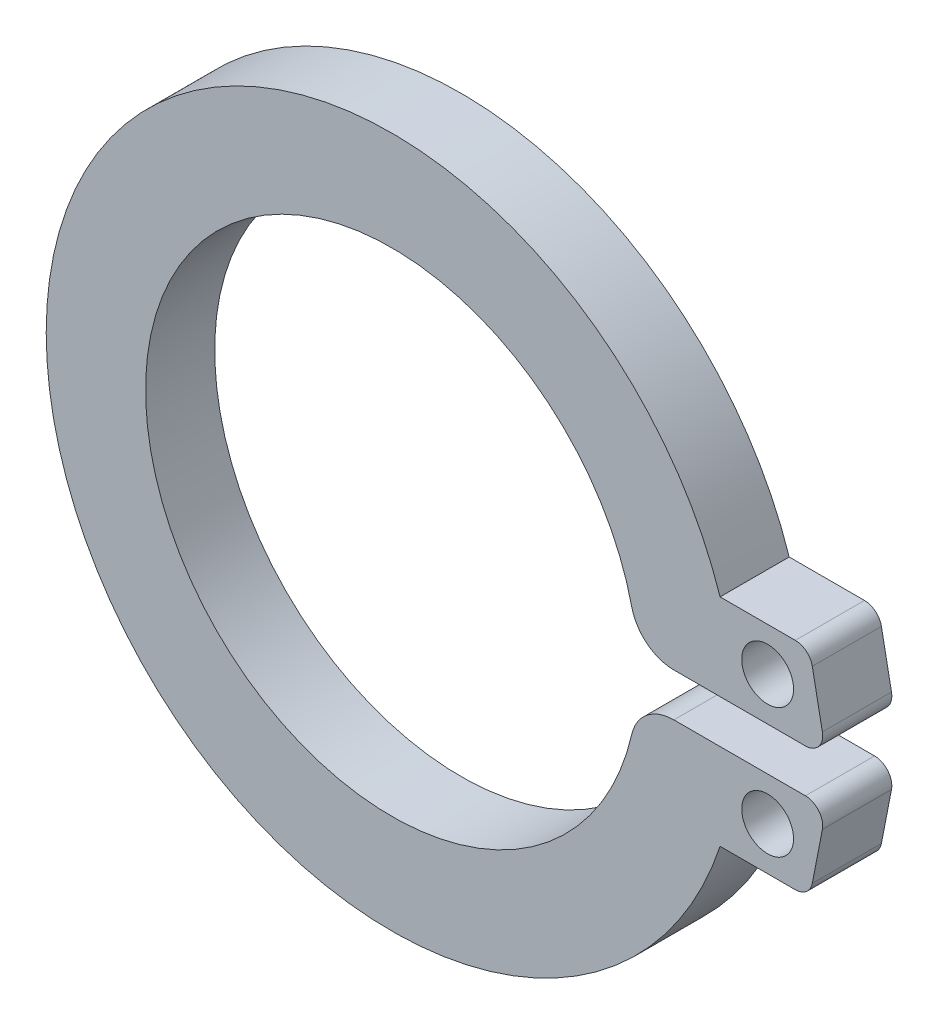
ISO-10303-21;
HEADER;
FILE_DESCRIPTION(('STEP AP214'),'2;1');
FILE_NAME('part.step','',(''),(''),'','','');
FILE_SCHEMA(('AUTOMOTIVE_DESIGN { 1 0 10303 214 1 1 1 1 }'));
ENDSEC;
DATA;
#1=APPLICATION_CONTEXT('core data for automotive mechanical design processes');
#2=APPLICATION_PROTOCOL_DEFINITION('international standard','automotive_design',2000,#1);
#3=PRODUCT_CONTEXT('',#1,'mechanical');
#4=PRODUCT('Part','Part','',(#3));
#5=PRODUCT_RELATED_PRODUCT_CATEGORY('part','',(#4));
#6=PRODUCT_DEFINITION_FORMATION('','',#4);
#7=PRODUCT_DEFINITION_CONTEXT('part definition',#1,'design');
#8=PRODUCT_DEFINITION('design','',#6,#7);
#9=PRODUCT_DEFINITION_SHAPE('','',#8);
#10=(LENGTH_UNIT() NAMED_UNIT(*) SI_UNIT(.MILLI.,.METRE.));
#11=(NAMED_UNIT(*) PLANE_ANGLE_UNIT() SI_UNIT($,.RADIAN.));
#12=(NAMED_UNIT(*) SI_UNIT($,.STERADIAN.) SOLID_ANGLE_UNIT());
#13=UNCERTAINTY_MEASURE_WITH_UNIT(LENGTH_MEASURE(1.E-05),#10,'distance_accuracy_value','');
#14=(GEOMETRIC_REPRESENTATION_CONTEXT(3) GLOBAL_UNCERTAINTY_ASSIGNED_CONTEXT((#13)) GLOBAL_UNIT_ASSIGNED_CONTEXT((#10,
#11,#12)) REPRESENTATION_CONTEXT('',''));
#15=CARTESIAN_POINT('',(0.,0.,0.));
#16=DIRECTION('',(0.,0.,1.));
#17=DIRECTION('',(1.,0.,0.));
#18=AXIS2_PLACEMENT_3D('',#15,#16,#17);
#19=CARTESIAN_POINT('',(0.,-0.249999999999999,0.4));
#20=DIRECTION('',(0.,1.,0.));
#21=DIRECTION('',(-1.,0.,0.));
#22=AXIS2_PLACEMENT_3D('',#19,#20,#21);
#23=PLANE('',#22);
#24=DIRECTION('',(1.,0.,0.));
#25=VECTOR('',#24,1.);
#26=CARTESIAN_POINT('',(0.,-0.249999999999999,-0.4));
#27=LINE('',#26,#25);
#28=CARTESIAN_POINT('',(3.2649655434629,-0.249999999999999,-0.4));
#29=VERTEX_POINT('',#28);
#30=CARTESIAN_POINT('',(4.78738059918141,-0.249999999999999,-0.4));
#31=VERTEX_POINT('',#30);
#32=EDGE_CURVE('E179',#29,#31,#27,.T.);
#33=ORIENTED_EDGE('',*,*,#32,.F.);
#34=DIRECTION('',(0.,0.,-1.));
#35=VECTOR('',#34,1.);
#36=CARTESIAN_POINT('',(3.2649655434629,-0.249999999999999,0.4));
#37=LINE('',#36,#35);
#38=CARTESIAN_POINT('',(3.2649655434629,-0.249999999999999,0.4));
#39=VERTEX_POINT('',#38);
#40=EDGE_CURVE('E11',#39,#29,#37,.T.);
#41=ORIENTED_EDGE('',*,*,#40,.F.);
#42=DIRECTION('',(1.,0.,0.));
#43=VECTOR('',#42,1.);
#44=CARTESIAN_POINT('',(0.,-0.249999999999999,0.4));
#45=LINE('',#44,#43);
#46=CARTESIAN_POINT('',(4.78738059918141,-0.249999999999999,0.4));
#47=VERTEX_POINT('',#46);
#48=EDGE_CURVE('E263',#39,#47,#45,.T.);
#49=ORIENTED_EDGE('',*,*,#48,.T.);
#50=DIRECTION('',(0.,0.,-1.));
#51=VECTOR('',#50,1.);
#52=CARTESIAN_POINT('',(4.78738059918141,-0.249999999999999,0.4));
#53=LINE('',#52,#51);
#54=EDGE_CURVE('E112',#47,#31,#53,.T.);
#55=ORIENTED_EDGE('',*,*,#54,.T.);
#56=EDGE_LOOP('',(#33,#41,#49,#55));
#57=FACE_BOUND('',#56,.T.);
#58=ADVANCED_FACE('F43',(#57),#23,.T.);
#59=CARTESIAN_POINT('',(3.2649655434629,-0.749999999999999,0.4));
#60=DIRECTION('',(0.,0.,-1.));
#61=DIRECTION('',(-1.,0.,0.));
#62=AXIS2_PLACEMENT_3D('',#59,#60,#61);
#63=CYLINDRICAL_SURFACE('',#62,0.5);
#64=CARTESIAN_POINT('',(3.2649655434629,-0.749999999999999,-0.4));
#65=DIRECTION('',(0.,0.,1.));
#66=DIRECTION('',(1.,0.,0.));
#67=AXIS2_PLACEMENT_3D('',#64,#65,#66);
#68=CIRCLE('',#67,0.5);
#69=CARTESIAN_POINT('',(2.77765725339381,-0.638059701492538,-0.4));
#70=VERTEX_POINT('',#69);
#71=EDGE_CURVE('E182',#29,#70,#68,.T.);
#72=ORIENTED_EDGE('',*,*,#71,.T.);
#73=DIRECTION('',(0.,0.,-1.));
#74=VECTOR('',#73,1.);
#75=CARTESIAN_POINT('',(2.77765725339381,-0.638059701492538,0.4));
#76=LINE('',#75,#74);
#77=CARTESIAN_POINT('',(2.77765725339381,-0.638059701492538,0.4));
#78=VERTEX_POINT('',#77);
#79=EDGE_CURVE('E52',#78,#70,#76,.T.);
#80=ORIENTED_EDGE('',*,*,#79,.F.);
#81=CARTESIAN_POINT('',(3.2649655434629,-0.749999999999999,0.4));
#82=DIRECTION('',(0.,0.,1.));
#83=DIRECTION('',(1.,0.,0.));
#84=AXIS2_PLACEMENT_3D('',#81,#82,#83);
#85=CIRCLE('',#84,0.5);
#86=EDGE_CURVE('E261',#39,#78,#85,.T.);
#87=ORIENTED_EDGE('',*,*,#86,.F.);
#88=ORIENTED_EDGE('',*,*,#40,.T.);
#89=EDGE_LOOP('',(#72,#80,#87,#88));
#90=FACE_BOUND('',#89,.T.);
#91=ADVANCED_FACE('F247',(#90),#63,.T.);
#92=CARTESIAN_POINT('',(0.,0.,0.4));
#93=DIRECTION('',(0.,0.,-1.));
#94=DIRECTION('',(-1.,0.,0.));
#95=AXIS2_PLACEMENT_3D('',#92,#93,#94);
#96=CYLINDRICAL_SURFACE('',#95,2.85);
#97=CARTESIAN_POINT('',(0.,0.,-0.4));
#98=DIRECTION('',(0.,0.,1.));
#99=DIRECTION('',(1.,0.,0.));
#100=AXIS2_PLACEMENT_3D('',#97,#98,#99);
#101=CIRCLE('',#100,2.85);
#102=CARTESIAN_POINT('',(2.77765725339381,0.638059701492538,-0.4));
#103=VERTEX_POINT('',#102);
#104=EDGE_CURVE('E185',#103,#70,#101,.T.);
#105=ORIENTED_EDGE('',*,*,#104,.F.);
#106=DIRECTION('',(0.,0.,-1.));
#107=VECTOR('',#106,1.);
#108=CARTESIAN_POINT('',(2.77765725339381,0.638059701492538,0.4));
#109=LINE('',#108,#107);
#110=CARTESIAN_POINT('',(2.77765725339381,0.638059701492538,0.4));
#111=VERTEX_POINT('',#110);
#112=EDGE_CURVE('E237',#111,#103,#109,.T.);
#113=ORIENTED_EDGE('',*,*,#112,.F.);
#114=CARTESIAN_POINT('',(0.,0.,0.4));
#115=DIRECTION('',(0.,0.,1.));
#116=DIRECTION('',(1.,0.,0.));
#117=AXIS2_PLACEMENT_3D('',#114,#115,#116);
#118=CIRCLE('',#117,2.85);
#119=EDGE_CURVE('E244',#111,#78,#118,.T.);
#120=ORIENTED_EDGE('',*,*,#119,.T.);
#121=ORIENTED_EDGE('',*,*,#79,.T.);
#122=EDGE_LOOP('',(#105,#113,#120,#121));
#123=FACE_BOUND('',#122,.T.);
#124=ADVANCED_FACE('F242',(#123),#96,.F.);
#125=CARTESIAN_POINT('',(3.2649655434629,0.750000000000001,0.4));
#126=DIRECTION('',(0.,0.,-1.));
#127=DIRECTION('',(-1.,0.,0.));
#128=AXIS2_PLACEMENT_3D('',#125,#126,#127);
#129=CYLINDRICAL_SURFACE('',#128,0.5);
#130=CARTESIAN_POINT('',(3.2649655434629,0.750000000000001,-0.4));
#131=DIRECTION('',(0.,0.,1.));
#132=DIRECTION('',(1.,0.,0.));
#133=AXIS2_PLACEMENT_3D('',#130,#131,#132);
#134=CIRCLE('',#133,0.5);
#135=CARTESIAN_POINT('',(3.2649655434629,0.250000000000001,-0.4));
#136=VERTEX_POINT('',#135);
#137=EDGE_CURVE('E188',#103,#136,#134,.T.);
#138=ORIENTED_EDGE('',*,*,#137,.T.);
#139=DIRECTION('',(0.,0.,-1.));
#140=VECTOR('',#139,1.);
#141=CARTESIAN_POINT('',(3.2649655434629,0.250000000000001,0.4));
#142=LINE('',#141,#140);
#143=CARTESIAN_POINT('',(3.2649655434629,0.250000000000001,0.4));
#144=VERTEX_POINT('',#143);
#145=EDGE_CURVE('E235',#144,#136,#142,.T.);
#146=ORIENTED_EDGE('',*,*,#145,.F.);
#147=CARTESIAN_POINT('',(3.2649655434629,0.750000000000001,0.4));
#148=DIRECTION('',(0.,0.,1.));
#149=DIRECTION('',(1.,0.,0.));
#150=AXIS2_PLACEMENT_3D('',#147,#148,#149);
#151=CIRCLE('',#150,0.5);
#152=EDGE_CURVE('E257',#111,#144,#151,.T.);
#153=ORIENTED_EDGE('',*,*,#152,.F.);
#154=ORIENTED_EDGE('',*,*,#112,.T.);
#155=EDGE_LOOP('',(#138,#146,#153,#154));
#156=FACE_BOUND('',#155,.T.);
#157=ADVANCED_FACE('F254',(#156),#129,.T.);
#158=CARTESIAN_POINT('',(0.,0.250000000000001,0.4));
#159=DIRECTION('',(0.,-1.,0.));
#160=DIRECTION('',(1.,0.,0.));
#161=AXIS2_PLACEMENT_3D('',#158,#159,#160);
#162=PLANE('',#161);
#163=DIRECTION('',(-1.,0.,0.));
#164=VECTOR('',#163,1.);
#165=CARTESIAN_POINT('',(0.,0.250000000000001,-0.4));
#166=LINE('',#165,#164);
#167=CARTESIAN_POINT('',(4.78738059918141,0.250000000000001,-0.4));
#168=VERTEX_POINT('',#167);
#169=EDGE_CURVE('E191',#168,#136,#166,.T.);
#170=ORIENTED_EDGE('',*,*,#169,.F.);
#171=DIRECTION('',(0.,0.,-1.));
#172=VECTOR('',#171,1.);
#173=CARTESIAN_POINT('',(4.78738059918141,0.250000000000001,0.4));
#174=LINE('',#173,#172);
#175=CARTESIAN_POINT('',(4.78738059918141,0.250000000000001,0.4));
#176=VERTEX_POINT('',#175);
#177=EDGE_CURVE('E233',#176,#168,#174,.T.);
#178=ORIENTED_EDGE('',*,*,#177,.F.);
#179=DIRECTION('',(-1.,0.,0.));
#180=VECTOR('',#179,1.);
#181=CARTESIAN_POINT('',(0.,0.250000000000001,0.4));
#182=LINE('',#181,#180);
#183=EDGE_CURVE('E259',#176,#144,#182,.T.);
#184=ORIENTED_EDGE('',*,*,#183,.T.);
#185=ORIENTED_EDGE('',*,*,#145,.T.);
#186=EDGE_LOOP('',(#170,#178,#184,#185));
#187=FACE_BOUND('',#186,.T.);
#188=ADVANCED_FACE('F326',(#187),#162,.T.);
#189=CARTESIAN_POINT('',(4.78738059918141,0.450000000000001,0.4));
#190=DIRECTION('',(0.,0.,-1.));
#191=DIRECTION('',(-1.,0.,0.));
#192=AXIS2_PLACEMENT_3D('',#189,#190,#191);
#193=CYLINDRICAL_SURFACE('',#192,0.2);
#194=CARTESIAN_POINT('',(4.78738059918141,0.450000000000001,-0.4));
#195=DIRECTION('',(0.,0.,1.));
#196=DIRECTION('',(1.,0.,0.));
#197=AXIS2_PLACEMENT_3D('',#194,#195,#196);
#198=CIRCLE('',#197,0.2);
#199=CARTESIAN_POINT('',(4.98370603587094,0.488161799075313,-0.4));
#200=VERTEX_POINT('',#199);
#201=EDGE_CURVE('E194',#200,#168,#198,.F.);
#202=ORIENTED_EDGE('',*,*,#201,.F.);
#203=DIRECTION('',(0.,0.,-1.));
#204=VECTOR('',#203,1.);
#205=CARTESIAN_POINT('',(4.98370603587094,0.488161799075313,0.4));
#206=LINE('',#205,#204);
#207=CARTESIAN_POINT('',(4.98370603587094,0.488161799075313,0.4));
#208=VERTEX_POINT('',#207);
#209=EDGE_CURVE('E231',#208,#200,#206,.T.);
#210=ORIENTED_EDGE('',*,*,#209,.F.);
#211=CARTESIAN_POINT('',(4.78738059918141,0.450000000000001,0.4));
#212=DIRECTION('',(0.,0.,1.));
#213=DIRECTION('',(1.,0.,0.));
#214=AXIS2_PLACEMENT_3D('',#211,#212,#213);
#215=CIRCLE('',#214,0.2);
#216=EDGE_CURVE('E268',#208,#176,#215,.F.);
#217=ORIENTED_EDGE('',*,*,#216,.T.);
#218=ORIENTED_EDGE('',*,*,#177,.T.);
#219=EDGE_LOOP('',(#202,#210,#217,#218));
#220=FACE_BOUND('',#219,.T.);
#221=ADVANCED_FACE('F329',(#220),#193,.T.);
#222=CARTESIAN_POINT('',(4.89369321841245,0.951237600620193,0.4));
#223=DIRECTION('',(-0.981627183447663,-0.19080899537655,0.));
#224=DIRECTION('',(0.19080899537655,-0.981627183447663,0.));
#225=AXIS2_PLACEMENT_3D('',#222,#223,#224);
#226=PLANE('',#225);
#227=DIRECTION('',(-0.19080899537655,0.981627183447663,0.));
#228=VECTOR('',#227,1.);
#229=CARTESIAN_POINT('',(4.89369321841245,0.951237600620193,-0.4));
#230=LINE('',#229,#228);
#231=CARTESIAN_POINT('',(4.86707785038831,1.08816179907531,-0.4));
#232=VERTEX_POINT('',#231);
#233=EDGE_CURVE('E197',#200,#232,#230,.T.);
#234=ORIENTED_EDGE('',*,*,#233,.T.);
#235=DIRECTION('',(0.,0.,-1.));
#236=VECTOR('',#235,1.);
#237=CARTESIAN_POINT('',(4.86707785038831,1.08816179907531,0.4));
#238=LINE('',#237,#236);
#239=CARTESIAN_POINT('',(4.86707785038831,1.08816179907531,0.4));
#240=VERTEX_POINT('',#239);
#241=EDGE_CURVE('E228',#240,#232,#238,.T.);
#242=ORIENTED_EDGE('',*,*,#241,.F.);
#243=DIRECTION('',(-0.19080899537655,0.981627183447663,0.));
#244=VECTOR('',#243,1.);
#245=CARTESIAN_POINT('',(4.89369321841245,0.951237600620193,0.4));
#246=LINE('',#245,#244);
#247=EDGE_CURVE('E271',#208,#240,#246,.T.);
#248=ORIENTED_EDGE('',*,*,#247,.F.);
#249=ORIENTED_EDGE('',*,*,#209,.T.);
#250=EDGE_LOOP('',(#234,#242,#248,#249));
#251=FACE_BOUND('',#250,.T.);
#252=ADVANCED_FACE('F333',(#251),#226,.F.);
#253=CARTESIAN_POINT('',(4.67075241369878,1.05,0.4));
#254=DIRECTION('',(0.,0.,-1.));
#255=DIRECTION('',(-1.,0.,0.));
#256=AXIS2_PLACEMENT_3D('',#253,#254,#255);
#257=CYLINDRICAL_SURFACE('',#256,0.2);
#258=CARTESIAN_POINT('',(4.67075241369878,1.05,-0.4));
#259=DIRECTION('',(0.,0.,1.));
#260=DIRECTION('',(1.,0.,0.));
#261=AXIS2_PLACEMENT_3D('',#258,#259,#260);
#262=CIRCLE('',#261,0.2);
#263=CARTESIAN_POINT('',(4.67075241369878,1.25,-0.4));
#264=VERTEX_POINT('',#263);
#265=EDGE_CURVE('E200',#232,#264,#262,.T.);
#266=ORIENTED_EDGE('',*,*,#265,.T.);
#267=DIRECTION('',(0.,0.,-1.));
#268=VECTOR('',#267,1.);
#269=CARTESIAN_POINT('',(4.67075241369878,1.25,0.4));
#270=LINE('',#269,#268);
#271=CARTESIAN_POINT('',(4.67075241369878,1.25,0.4));
#272=VERTEX_POINT('',#271);
#273=EDGE_CURVE('E226',#272,#264,#270,.T.);
#274=ORIENTED_EDGE('',*,*,#273,.F.);
#275=CARTESIAN_POINT('',(4.67075241369878,1.05,0.4));
#276=DIRECTION('',(0.,0.,1.));
#277=DIRECTION('',(1.,0.,0.));
#278=AXIS2_PLACEMENT_3D('',#275,#276,#277);
#279=CIRCLE('',#278,0.2);
#280=EDGE_CURVE('E274',#240,#272,#279,.T.);
#281=ORIENTED_EDGE('',*,*,#280,.F.);
#282=ORIENTED_EDGE('',*,*,#241,.T.);
#283=EDGE_LOOP('',(#266,#274,#281,#282));
#284=FACE_BOUND('',#283,.T.);
#285=ADVANCED_FACE('F337',(#284),#257,.T.);
#286=CARTESIAN_POINT('',(0.,1.25,0.4));
#287=DIRECTION('',(0.,1.,0.));
#288=DIRECTION('',(0.,0.,1.));
#289=AXIS2_PLACEMENT_3D('',#286,#287,#288);
#290=PLANE('',#289);
#291=DIRECTION('',(1.,0.,0.));
#292=VECTOR('',#291,1.);
#293=CARTESIAN_POINT('',(0.,1.25,-0.4));
#294=LINE('',#293,#292);
#295=CARTESIAN_POINT('',(3.79967103839267,1.25,-0.4));
#296=VERTEX_POINT('',#295);
#297=EDGE_CURVE('E203',#296,#264,#294,.T.);
#298=ORIENTED_EDGE('',*,*,#297,.F.);
#299=DIRECTION('',(0.,0.,-1.));
#300=VECTOR('',#299,1.);
#301=CARTESIAN_POINT('',(3.79967103839267,1.25,0.4));
#302=LINE('',#301,#300);
#303=CARTESIAN_POINT('',(3.79967103839267,1.25,0.4));
#304=VERTEX_POINT('',#303);
#305=EDGE_CURVE('E224',#304,#296,#302,.T.);
#306=ORIENTED_EDGE('',*,*,#305,.F.);
#307=DIRECTION('',(1.,0.,0.));
#308=VECTOR('',#307,1.);
#309=CARTESIAN_POINT('',(0.,1.25,0.4));
#310=LINE('',#309,#308);
#311=EDGE_CURVE('E276',#304,#272,#310,.T.);
#312=ORIENTED_EDGE('',*,*,#311,.T.);
#313=ORIENTED_EDGE('',*,*,#273,.T.);
#314=EDGE_LOOP('',(#298,#306,#312,#313));
#315=FACE_BOUND('',#314,.T.);
#316=ADVANCED_FACE('F341',(#315),#290,.T.);
#317=CARTESIAN_POINT('',(0.,0.,0.4));
#318=DIRECTION('',(0.,0.,-1.));
#319=DIRECTION('',(-1.,0.,0.));
#320=AXIS2_PLACEMENT_3D('',#317,#318,#319);
#321=CYLINDRICAL_SURFACE('',#320,4.);
#322=CARTESIAN_POINT('',(0.,0.,-0.4));
#323=DIRECTION('',(0.,0.,1.));
#324=DIRECTION('',(1.,0.,0.));
#325=AXIS2_PLACEMENT_3D('',#322,#323,#324);
#326=CIRCLE('',#325,4.);
#327=CARTESIAN_POINT('',(3.79967103839267,-1.25,-0.4));
#328=VERTEX_POINT('',#327);
#329=EDGE_CURVE('E206',#296,#328,#326,.T.);
#330=ORIENTED_EDGE('',*,*,#329,.T.);
#331=DIRECTION('',(0.,0.,-1.));
#332=VECTOR('',#331,1.);
#333=CARTESIAN_POINT('',(3.79967103839267,-1.25,0.4));
#334=LINE('',#333,#332);
#335=CARTESIAN_POINT('',(3.79967103839267,-1.25,0.4));
#336=VERTEX_POINT('',#335);
#337=EDGE_CURVE('E221',#336,#328,#334,.T.);
#338=ORIENTED_EDGE('',*,*,#337,.F.);
#339=CARTESIAN_POINT('',(0.,0.,0.4));
#340=DIRECTION('',(0.,0.,1.));
#341=DIRECTION('',(1.,0.,0.));
#342=AXIS2_PLACEMENT_3D('',#339,#340,#341);
#343=CIRCLE('',#342,4.);
#344=EDGE_CURVE('E279',#304,#336,#343,.T.);
#345=ORIENTED_EDGE('',*,*,#344,.F.);
#346=ORIENTED_EDGE('',*,*,#305,.T.);
#347=EDGE_LOOP('',(#330,#338,#345,#346));
#348=FACE_BOUND('',#347,.T.);
#349=ADVANCED_FACE('F284',(#348),#321,.T.);
#350=CARTESIAN_POINT('',(0.,-1.25,0.4));
#351=DIRECTION('',(0.,1.,0.));
#352=DIRECTION('',(-1.,0.,0.));
#353=AXIS2_PLACEMENT_3D('',#350,#351,#352);
#354=PLANE('',#353);
#355=DIRECTION('',(1.,0.,0.));
#356=VECTOR('',#355,1.);
#357=CARTESIAN_POINT('',(0.,-1.25,-0.4));
#358=LINE('',#357,#356);
#359=CARTESIAN_POINT('',(4.67075241369878,-1.25,-0.4));
#360=VERTEX_POINT('',#359);
#361=EDGE_CURVE('E209',#328,#360,#358,.T.);
#362=ORIENTED_EDGE('',*,*,#361,.T.);
#363=DIRECTION('',(0.,0.,-1.));
#364=VECTOR('',#363,1.);
#365=CARTESIAN_POINT('',(4.67075241369878,-1.25,0.4));
#366=LINE('',#365,#364);
#367=CARTESIAN_POINT('',(4.67075241369878,-1.25,0.4));
#368=VERTEX_POINT('',#367);
#369=EDGE_CURVE('E166',#368,#360,#366,.T.);
#370=ORIENTED_EDGE('',*,*,#369,.F.);
#371=DIRECTION('',(1.,0.,0.));
#372=VECTOR('',#371,1.);
#373=CARTESIAN_POINT('',(0.,-1.25,0.4));
#374=LINE('',#373,#372);
#375=EDGE_CURVE('E154',#336,#368,#374,.T.);
#376=ORIENTED_EDGE('',*,*,#375,.F.);
#377=ORIENTED_EDGE('',*,*,#337,.T.);
#378=EDGE_LOOP('',(#362,#370,#376,#377));
#379=FACE_BOUND('',#378,.T.);
#380=ADVANCED_FACE('F287',(#379),#354,.F.);
#381=CARTESIAN_POINT('',(4.67075241369878,-1.05,0.4));
#382=DIRECTION('',(0.,0.,-1.));
#383=DIRECTION('',(-1.,0.,0.));
#384=AXIS2_PLACEMENT_3D('',#381,#382,#383);
#385=CYLINDRICAL_SURFACE('',#384,0.2);
#386=CARTESIAN_POINT('',(4.67075241369878,-1.05,-0.4));
#387=DIRECTION('',(0.,0.,1.));
#388=DIRECTION('',(1.,0.,0.));
#389=AXIS2_PLACEMENT_3D('',#386,#387,#388);
#390=CIRCLE('',#389,0.2);
#391=CARTESIAN_POINT('',(4.86707785038831,-1.08816179907531,-0.4));
#392=VERTEX_POINT('',#391);
#393=EDGE_CURVE('E162',#360,#392,#390,.T.);
#394=ORIENTED_EDGE('',*,*,#393,.T.);
#395=DIRECTION('',(0.,0.,-1.));
#396=VECTOR('',#395,1.);
#397=CARTESIAN_POINT('',(4.86707785038831,-1.08816179907531,0.4));
#398=LINE('',#397,#396);
#399=CARTESIAN_POINT('',(4.86707785038831,-1.08816179907531,0.4));
#400=VERTEX_POINT('',#399);
#401=EDGE_CURVE('E160',#400,#392,#398,.T.);
#402=ORIENTED_EDGE('',*,*,#401,.F.);
#403=CARTESIAN_POINT('',(4.67075241369878,-1.05,0.4));
#404=DIRECTION('',(0.,0.,1.));
#405=DIRECTION('',(1.,0.,0.));
#406=AXIS2_PLACEMENT_3D('',#403,#404,#405);
#407=CIRCLE('',#406,0.2);
#408=EDGE_CURVE('E148',#368,#400,#407,.T.);
#409=ORIENTED_EDGE('',*,*,#408,.F.);
#410=ORIENTED_EDGE('',*,*,#369,.T.);
#411=EDGE_LOOP('',(#394,#402,#409,#410));
#412=FACE_BOUND('',#411,.T.);
#413=ADVANCED_FACE('F161',(#412),#385,.T.);
#414=CARTESIAN_POINT('',(4.89369321841245,-0.951237600620185,0.4));
#415=DIRECTION('',(0.981627183447663,-0.190808995376548,0.));
#416=DIRECTION('',(0.190808995376548,0.981627183447663,0.));
#417=AXIS2_PLACEMENT_3D('',#414,#415,#416);
#418=PLANE('',#417);
#419=DIRECTION('',(-0.190808995376548,-0.981627183447663,0.));
#420=VECTOR('',#419,1.);
#421=CARTESIAN_POINT('',(4.89369321841245,-0.951237600620185,-0.4));
#422=LINE('',#421,#420);
#423=CARTESIAN_POINT('',(4.98370603587095,-0.48816179907531,-0.4));
#424=VERTEX_POINT('',#423);
#425=EDGE_CURVE('E213',#424,#392,#422,.T.);
#426=ORIENTED_EDGE('',*,*,#425,.F.);
#427=DIRECTION('',(0.,0.,-1.));
#428=VECTOR('',#427,1.);
#429=CARTESIAN_POINT('',(4.98370603587095,-0.48816179907531,0.4));
#430=LINE('',#429,#428);
#431=CARTESIAN_POINT('',(4.98370603587095,-0.48816179907531,0.4));
#432=VERTEX_POINT('',#431);
#433=EDGE_CURVE('E105',#432,#424,#430,.T.);
#434=ORIENTED_EDGE('',*,*,#433,.F.);
#435=DIRECTION('',(-0.190808995376548,-0.981627183447663,0.));
#436=VECTOR('',#435,1.);
#437=CARTESIAN_POINT('',(4.89369321841245,-0.951237600620185,0.4));
#438=LINE('',#437,#436);
#439=EDGE_CURVE('E152',#432,#400,#438,.T.);
#440=ORIENTED_EDGE('',*,*,#439,.T.);
#441=ORIENTED_EDGE('',*,*,#401,.T.);
#442=EDGE_LOOP('',(#426,#434,#440,#441));
#443=FACE_BOUND('',#442,.T.);
#444=ADVANCED_FACE('F168',(#443),#418,.T.);
#445=CARTESIAN_POINT('',(4.35,-0.749999999999999,0.4));
#446=DIRECTION('',(0.,0.,-1.));
#447=DIRECTION('',(-1.,0.,0.));
#448=AXIS2_PLACEMENT_3D('',#445,#446,#447);
#449=CYLINDRICAL_SURFACE('',#448,0.3);
#450=CARTESIAN_POINT('',(4.35,-0.749999999999999,0.4));
#451=DIRECTION('',(0.,0.,1.));
#452=DIRECTION('',(1.,0.,0.));
#453=AXIS2_PLACEMENT_3D('',#450,#451,#452);
#454=CIRCLE('',#453,0.3);
#455=CARTESIAN_POINT('',(4.65,-0.749999999999999,0.4));
#456=VERTEX_POINT('',#455);
#457=EDGE_CURVE('E290',#456,#456,#454,.T.);
#458=ORIENTED_EDGE('',*,*,#457,.T.);
#459=EDGE_LOOP('',(#458));
#460=FACE_BOUND('',#459,.T.);
#461=CARTESIAN_POINT('',(4.35,-0.749999999999999,-0.4));
#462=DIRECTION('',(0.,0.,1.));
#463=DIRECTION('',(1.,0.,0.));
#464=AXIS2_PLACEMENT_3D('',#461,#462,#463);
#465=CIRCLE('',#464,0.3);
#466=CARTESIAN_POINT('',(4.65,-0.749999999999999,-0.4));
#467=VERTEX_POINT('',#466);
#468=EDGE_CURVE('E176',#467,#467,#465,.T.);
#469=ORIENTED_EDGE('',*,*,#468,.F.);
#470=EDGE_LOOP('',(#469));
#471=FACE_BOUND('',#470,.T.);
#472=ADVANCED_FACE('F301',(#460,#471),#449,.F.);
#473=CARTESIAN_POINT('',(4.34999999999999,0.749999999999999,0.4));
#474=DIRECTION('',(0.,0.,-1.));
#475=DIRECTION('',(-1.,0.,0.));
#476=AXIS2_PLACEMENT_3D('',#473,#474,#475);
#477=CYLINDRICAL_SURFACE('',#476,0.3);
#478=CARTESIAN_POINT('',(4.34999999999999,0.749999999999999,0.4));
#479=DIRECTION('',(0.,0.,1.));
#480=DIRECTION('',(1.,0.,0.));
#481=AXIS2_PLACEMENT_3D('',#478,#479,#480);
#482=CIRCLE('',#481,0.3);
#483=CARTESIAN_POINT('',(4.64999999999999,0.749999999999999,0.4));
#484=VERTEX_POINT('',#483);
#485=EDGE_CURVE('E217',#484,#484,#482,.F.);
#486=ORIENTED_EDGE('',*,*,#485,.F.);
#487=EDGE_LOOP('',(#486));
#488=FACE_BOUND('',#487,.T.);
#489=CARTESIAN_POINT('',(4.34999999999999,0.749999999999999,-0.4));
#490=DIRECTION('',(0.,0.,1.));
#491=DIRECTION('',(1.,0.,0.));
#492=AXIS2_PLACEMENT_3D('',#489,#490,#491);
#493=CIRCLE('',#492,0.3);
#494=CARTESIAN_POINT('',(4.64999999999999,0.749999999999999,-0.4));
#495=VERTEX_POINT('',#494);
#496=EDGE_CURVE('E173',#495,#495,#493,.F.);
#497=ORIENTED_EDGE('',*,*,#496,.T.);
#498=EDGE_LOOP('',(#497));
#499=FACE_BOUND('',#498,.T.);
#500=ADVANCED_FACE('F45',(#488,#499),#477,.F.);
#501=CARTESIAN_POINT('',(4.78738059918141,-0.449999999999999,0.4));
#502=DIRECTION('',(0.,0.,-1.));
#503=DIRECTION('',(-1.,0.,0.));
#504=AXIS2_PLACEMENT_3D('',#501,#502,#503);
#505=CYLINDRICAL_SURFACE('',#504,0.2);
#506=CARTESIAN_POINT('',(4.78738059918141,-0.449999999999999,-0.4));
#507=DIRECTION('',(0.,0.,1.));
#508=DIRECTION('',(1.,0.,0.));
#509=AXIS2_PLACEMENT_3D('',#506,#507,#508);
#510=CIRCLE('',#509,0.2);
#511=EDGE_CURVE('E215',#424,#31,#510,.T.);
#512=ORIENTED_EDGE('',*,*,#511,.T.);
#513=ORIENTED_EDGE('',*,*,#54,.F.);
#514=CARTESIAN_POINT('',(4.78738059918141,-0.449999999999999,0.4));
#515=DIRECTION('',(0.,0.,1.));
#516=DIRECTION('',(1.,0.,0.));
#517=AXIS2_PLACEMENT_3D('',#514,#515,#516);
#518=CIRCLE('',#517,0.2);
#519=EDGE_CURVE('E60',#432,#47,#518,.T.);
#520=ORIENTED_EDGE('',*,*,#519,.F.);
#521=ORIENTED_EDGE('',*,*,#433,.T.);
#522=EDGE_LOOP('',(#512,#513,#520,#521));
#523=FACE_BOUND('',#522,.T.);
#524=ADVANCED_FACE('F289',(#523),#505,.T.);
#525=CARTESIAN_POINT('',(0.,0.,0.4));
#526=DIRECTION('',(0.,0.,1.));
#527=DIRECTION('',(1.,0.,0.));
#528=AXIS2_PLACEMENT_3D('',#525,#526,#527);
#529=PLANE('',#528);
#530=ORIENTED_EDGE('',*,*,#485,.T.);
#531=EDGE_LOOP('',(#530));
#532=FACE_BOUND('',#531,.T.);
#533=ORIENTED_EDGE('',*,*,#457,.F.);
#534=EDGE_LOOP('',(#533));
#535=FACE_BOUND('',#534,.T.);
#536=ORIENTED_EDGE('',*,*,#48,.F.);
#537=ORIENTED_EDGE('',*,*,#86,.T.);
#538=ORIENTED_EDGE('',*,*,#119,.F.);
#539=ORIENTED_EDGE('',*,*,#152,.T.);
#540=ORIENTED_EDGE('',*,*,#183,.F.);
#541=ORIENTED_EDGE('',*,*,#216,.F.);
#542=ORIENTED_EDGE('',*,*,#247,.T.);
#543=ORIENTED_EDGE('',*,*,#280,.T.);
#544=ORIENTED_EDGE('',*,*,#311,.F.);
#545=ORIENTED_EDGE('',*,*,#344,.T.);
#546=ORIENTED_EDGE('',*,*,#375,.T.);
#547=ORIENTED_EDGE('',*,*,#408,.T.);
#548=ORIENTED_EDGE('',*,*,#439,.F.);
#549=ORIENTED_EDGE('',*,*,#519,.T.);
#550=EDGE_LOOP('',(#536,#537,#538,#539,#540,#541,#542,#543,#544,#545,#546,#547,#548,#549));
#551=FACE_BOUND('',#550,.T.);
#552=ADVANCED_FACE('F150',(#532,#535,#551),#529,.T.);
#553=CARTESIAN_POINT('',(0.,0.,-0.4));
#554=DIRECTION('',(0.,0.,1.));
#555=DIRECTION('',(1.,0.,0.));
#556=AXIS2_PLACEMENT_3D('',#553,#554,#555);
#557=PLANE('',#556);
#558=ORIENTED_EDGE('',*,*,#496,.F.);
#559=EDGE_LOOP('',(#558));
#560=FACE_BOUND('',#559,.T.);
#561=ORIENTED_EDGE('',*,*,#468,.T.);
#562=EDGE_LOOP('',(#561));
#563=FACE_BOUND('',#562,.T.);
#564=ORIENTED_EDGE('',*,*,#32,.T.);
#565=ORIENTED_EDGE('',*,*,#511,.F.);
#566=ORIENTED_EDGE('',*,*,#425,.T.);
#567=ORIENTED_EDGE('',*,*,#393,.F.);
#568=ORIENTED_EDGE('',*,*,#361,.F.);
#569=ORIENTED_EDGE('',*,*,#329,.F.);
#570=ORIENTED_EDGE('',*,*,#297,.T.);
#571=ORIENTED_EDGE('',*,*,#265,.F.);
#572=ORIENTED_EDGE('',*,*,#233,.F.);
#573=ORIENTED_EDGE('',*,*,#201,.T.);
#574=ORIENTED_EDGE('',*,*,#169,.T.);
#575=ORIENTED_EDGE('',*,*,#137,.F.);
#576=ORIENTED_EDGE('',*,*,#104,.T.);
#577=ORIENTED_EDGE('',*,*,#71,.F.);
#578=EDGE_LOOP('',(#564,#565,#566,#567,#568,#569,#570,#571,#572,#573,#574,#575,#576,#577));
#579=FACE_BOUND('',#578,.T.);
#580=ADVANCED_FACE('F250',(#560,#563,#579),#557,.F.);
#581=CLOSED_SHELL('',(#58,#91,#124,#157,#188,#221,#252,#285,#316,#349,#380,#413,#444,#472,#500,
#524,#552,#580));
#582=MANIFOLD_SOLID_BREP('B2',#581);
#583=ADVANCED_BREP_SHAPE_REPRESENTATION('',(#18,#582),#14);
#584=SHAPE_DEFINITION_REPRESENTATION(#9,#583);
ENDSEC;
END-ISO-10303-21;
